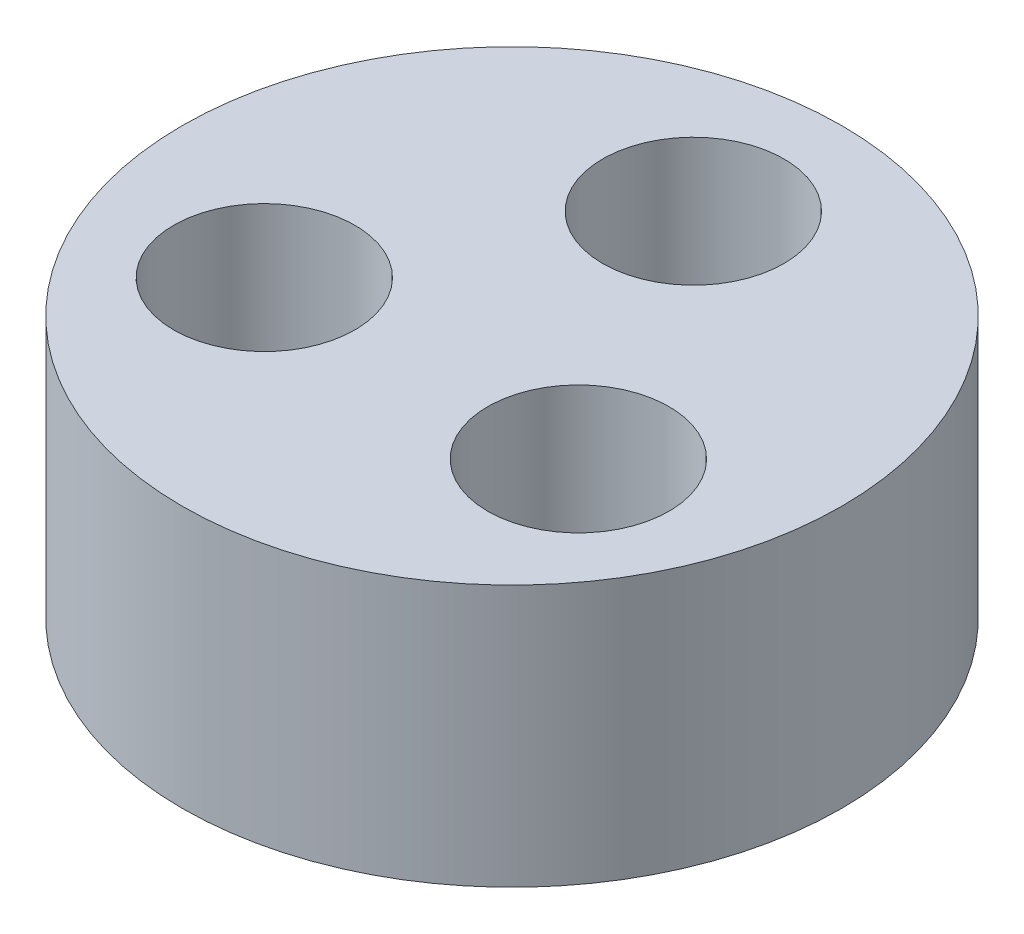
ISO-10303-21;
HEADER;
FILE_DESCRIPTION(('STEP AP214'),'2;1');
FILE_NAME('part.step','',(''),(''),'','','');
FILE_SCHEMA(('AUTOMOTIVE_DESIGN { 1 0 10303 214 1 1 1 1 }'));
ENDSEC;
DATA;
#1=APPLICATION_CONTEXT('core data for automotive mechanical design processes');
#2=APPLICATION_PROTOCOL_DEFINITION('international standard','automotive_design',2000,#1);
#3=PRODUCT_CONTEXT('',#1,'mechanical');
#4=PRODUCT('Part','Part','',(#3));
#5=PRODUCT_RELATED_PRODUCT_CATEGORY('part','',(#4));
#6=PRODUCT_DEFINITION_FORMATION('','',#4);
#7=PRODUCT_DEFINITION_CONTEXT('part definition',#1,'design');
#8=PRODUCT_DEFINITION('design','',#6,#7);
#9=PRODUCT_DEFINITION_SHAPE('','',#8);
#10=(LENGTH_UNIT() NAMED_UNIT(*) SI_UNIT(.MILLI.,.METRE.));
#11=(NAMED_UNIT(*) PLANE_ANGLE_UNIT() SI_UNIT($,.RADIAN.));
#12=(NAMED_UNIT(*) SI_UNIT($,.STERADIAN.) SOLID_ANGLE_UNIT());
#13=UNCERTAINTY_MEASURE_WITH_UNIT(LENGTH_MEASURE(1.E-05),#10,'distance_accuracy_value','');
#14=(GEOMETRIC_REPRESENTATION_CONTEXT(3) GLOBAL_UNCERTAINTY_ASSIGNED_CONTEXT((#13)) GLOBAL_UNIT_ASSIGNED_CONTEXT((#10,
#11,#12)) REPRESENTATION_CONTEXT('',''));
#15=CARTESIAN_POINT('',(0.,0.,0.));
#16=DIRECTION('',(0.,0.,1.));
#17=DIRECTION('',(1.,0.,0.));
#18=AXIS2_PLACEMENT_3D('',#15,#16,#17);
#19=CARTESIAN_POINT('',(0.,3.175,0.));
#20=DIRECTION('',(0.,1.,0.));
#21=DIRECTION('',(0.,0.,1.));
#22=AXIS2_PLACEMENT_3D('',#19,#20,#21);
#23=PLANE('',#22);
#24=CARTESIAN_POINT('',(1.90525588832576,3.175,1.1));
#25=DIRECTION('',(0.,1.,0.));
#26=DIRECTION('',(0.,0.,1.));
#27=AXIS2_PLACEMENT_3D('',#24,#25,#26);
#28=CIRCLE('',#27,1.1);
#29=CARTESIAN_POINT('',(1.90525588832576,3.175,2.2));
#30=VERTEX_POINT('',#29);
#31=EDGE_CURVE('E47',#30,#30,#28,.T.);
#32=ORIENTED_EDGE('',*,*,#31,.F.);
#33=EDGE_LOOP('',(#32));
#34=FACE_BOUND('',#33,.T.);
#35=CARTESIAN_POINT('',(0.,3.175,0.));
#36=DIRECTION('',(0.,1.,0.));
#37=DIRECTION('',(0.,0.,1.));
#38=AXIS2_PLACEMENT_3D('',#35,#36,#37);
#39=CIRCLE('',#38,4.);
#40=CARTESIAN_POINT('',(0.,3.175,4.));
#41=VERTEX_POINT('',#40);
#42=EDGE_CURVE('E10',#41,#41,#39,.T.);
#43=ORIENTED_EDGE('',*,*,#42,.T.);
#44=EDGE_LOOP('',(#43));
#45=FACE_BOUND('',#44,.T.);
#46=CARTESIAN_POINT('',(0.,3.175,-2.2));
#47=DIRECTION('',(0.,1.,0.));
#48=DIRECTION('',(0.,0.,1.));
#49=AXIS2_PLACEMENT_3D('',#46,#47,#48);
#50=CIRCLE('',#49,1.1);
#51=CARTESIAN_POINT('',(0.,3.175,-1.1));
#52=VERTEX_POINT('',#51);
#53=EDGE_CURVE('E42',#52,#52,#50,.T.);
#54=ORIENTED_EDGE('',*,*,#53,.F.);
#55=EDGE_LOOP('',(#54));
#56=FACE_BOUND('',#55,.T.);
#57=CARTESIAN_POINT('',(-1.90525588832576,3.175,1.1));
#58=DIRECTION('',(0.,1.,0.));
#59=DIRECTION('',(0.,0.,1.));
#60=AXIS2_PLACEMENT_3D('',#57,#58,#59);
#61=CIRCLE('',#60,1.1);
#62=CARTESIAN_POINT('',(-1.90525588832576,3.175,2.2));
#63=VERTEX_POINT('',#62);
#64=EDGE_CURVE('E53',#63,#63,#61,.T.);
#65=ORIENTED_EDGE('',*,*,#64,.F.);
#66=EDGE_LOOP('',(#65));
#67=FACE_BOUND('',#66,.T.);
#68=ADVANCED_FACE('F31',(#34,#45,#56,#67),#23,.T.);
#69=CARTESIAN_POINT('',(0.,0.,0.));
#70=DIRECTION('',(0.,1.,0.));
#71=DIRECTION('',(0.,0.,1.));
#72=AXIS2_PLACEMENT_3D('',#69,#70,#71);
#73=PLANE('',#72);
#74=CARTESIAN_POINT('',(0.,0.,0.));
#75=DIRECTION('',(0.,1.,0.));
#76=DIRECTION('',(0.,0.,1.));
#77=AXIS2_PLACEMENT_3D('',#74,#75,#76);
#78=CIRCLE('',#77,4.);
#79=CARTESIAN_POINT('',(0.,0.,4.));
#80=VERTEX_POINT('',#79);
#81=EDGE_CURVE('E35',#80,#80,#78,.T.);
#82=ORIENTED_EDGE('',*,*,#81,.F.);
#83=EDGE_LOOP('',(#82));
#84=FACE_BOUND('',#83,.T.);
#85=CARTESIAN_POINT('',(0.,0.,-2.2));
#86=DIRECTION('',(0.,1.,0.));
#87=DIRECTION('',(0.,0.,1.));
#88=AXIS2_PLACEMENT_3D('',#85,#86,#87);
#89=CIRCLE('',#88,1.1);
#90=CARTESIAN_POINT('',(0.,0.,-1.1));
#91=VERTEX_POINT('',#90);
#92=EDGE_CURVE('E44',#91,#91,#89,.T.);
#93=ORIENTED_EDGE('',*,*,#92,.T.);
#94=EDGE_LOOP('',(#93));
#95=FACE_BOUND('',#94,.T.);
#96=CARTESIAN_POINT('',(1.90525588832576,0.,1.1));
#97=DIRECTION('',(0.,1.,0.));
#98=DIRECTION('',(0.,0.,1.));
#99=AXIS2_PLACEMENT_3D('',#96,#97,#98);
#100=CIRCLE('',#99,1.1);
#101=CARTESIAN_POINT('',(1.90525588832576,0.,2.2));
#102=VERTEX_POINT('',#101);
#103=EDGE_CURVE('E50',#102,#102,#100,.T.);
#104=ORIENTED_EDGE('',*,*,#103,.T.);
#105=EDGE_LOOP('',(#104));
#106=FACE_BOUND('',#105,.T.);
#107=CARTESIAN_POINT('',(-1.90525588832576,0.,1.1));
#108=DIRECTION('',(0.,1.,0.));
#109=DIRECTION('',(0.,0.,1.));
#110=AXIS2_PLACEMENT_3D('',#107,#108,#109);
#111=CIRCLE('',#110,1.1);
#112=CARTESIAN_POINT('',(-1.90525588832576,0.,2.2));
#113=VERTEX_POINT('',#112);
#114=EDGE_CURVE('E56',#113,#113,#111,.T.);
#115=ORIENTED_EDGE('',*,*,#114,.T.);
#116=EDGE_LOOP('',(#115));
#117=FACE_BOUND('',#116,.T.);
#118=ADVANCED_FACE('F66',(#84,#95,#106,#117),#73,.F.);
#119=CARTESIAN_POINT('',(0.,3.175,0.));
#120=DIRECTION('',(0.,-1.,0.));
#121=DIRECTION('',(0.,0.,-1.));
#122=AXIS2_PLACEMENT_3D('',#119,#120,#121);
#123=CYLINDRICAL_SURFACE('',#122,4.);
#124=ORIENTED_EDGE('',*,*,#42,.F.);
#125=EDGE_LOOP('',(#124));
#126=FACE_BOUND('',#125,.T.);
#127=ORIENTED_EDGE('',*,*,#81,.T.);
#128=EDGE_LOOP('',(#127));
#129=FACE_BOUND('',#128,.T.);
#130=ADVANCED_FACE('F33',(#126,#129),#123,.T.);
#131=CARTESIAN_POINT('',(0.,3.175,-2.2));
#132=DIRECTION('',(0.,-1.,0.));
#133=DIRECTION('',(0.,0.,-1.));
#134=AXIS2_PLACEMENT_3D('',#131,#132,#133);
#135=CYLINDRICAL_SURFACE('',#134,1.1);
#136=ORIENTED_EDGE('',*,*,#53,.T.);
#137=EDGE_LOOP('',(#136));
#138=FACE_BOUND('',#137,.T.);
#139=ORIENTED_EDGE('',*,*,#92,.F.);
#140=EDGE_LOOP('',(#139));
#141=FACE_BOUND('',#140,.T.);
#142=ADVANCED_FACE('F75',(#138,#141),#135,.F.);
#143=CARTESIAN_POINT('',(1.90525588832576,3.175,1.1));
#144=DIRECTION('',(0.,-1.,0.));
#145=DIRECTION('',(0.,0.,-1.));
#146=AXIS2_PLACEMENT_3D('',#143,#144,#145);
#147=CYLINDRICAL_SURFACE('',#146,1.1);
#148=ORIENTED_EDGE('',*,*,#31,.T.);
#149=EDGE_LOOP('',(#148));
#150=FACE_BOUND('',#149,.T.);
#151=ORIENTED_EDGE('',*,*,#103,.F.);
#152=EDGE_LOOP('',(#151));
#153=FACE_BOUND('',#152,.T.);
#154=ADVANCED_FACE('F78',(#150,#153),#147,.F.);
#155=CARTESIAN_POINT('',(-1.90525588832576,3.175,1.1));
#156=DIRECTION('',(0.,-1.,0.));
#157=DIRECTION('',(0.,0.,-1.));
#158=AXIS2_PLACEMENT_3D('',#155,#156,#157);
#159=CYLINDRICAL_SURFACE('',#158,1.1);
#160=ORIENTED_EDGE('',*,*,#64,.T.);
#161=EDGE_LOOP('',(#160));
#162=FACE_BOUND('',#161,.T.);
#163=ORIENTED_EDGE('',*,*,#114,.F.);
#164=EDGE_LOOP('',(#163));
#165=FACE_BOUND('',#164,.T.);
#166=ADVANCED_FACE('F62',(#162,#165),#159,.F.);
#167=CLOSED_SHELL('',(#68,#118,#130,#142,#154,#166));
#168=MANIFOLD_SOLID_BREP('B2',#167);
#169=ADVANCED_BREP_SHAPE_REPRESENTATION('',(#18,#168),#14);
#170=SHAPE_DEFINITION_REPRESENTATION(#9,#169);
ENDSEC;
END-ISO-10303-21;
